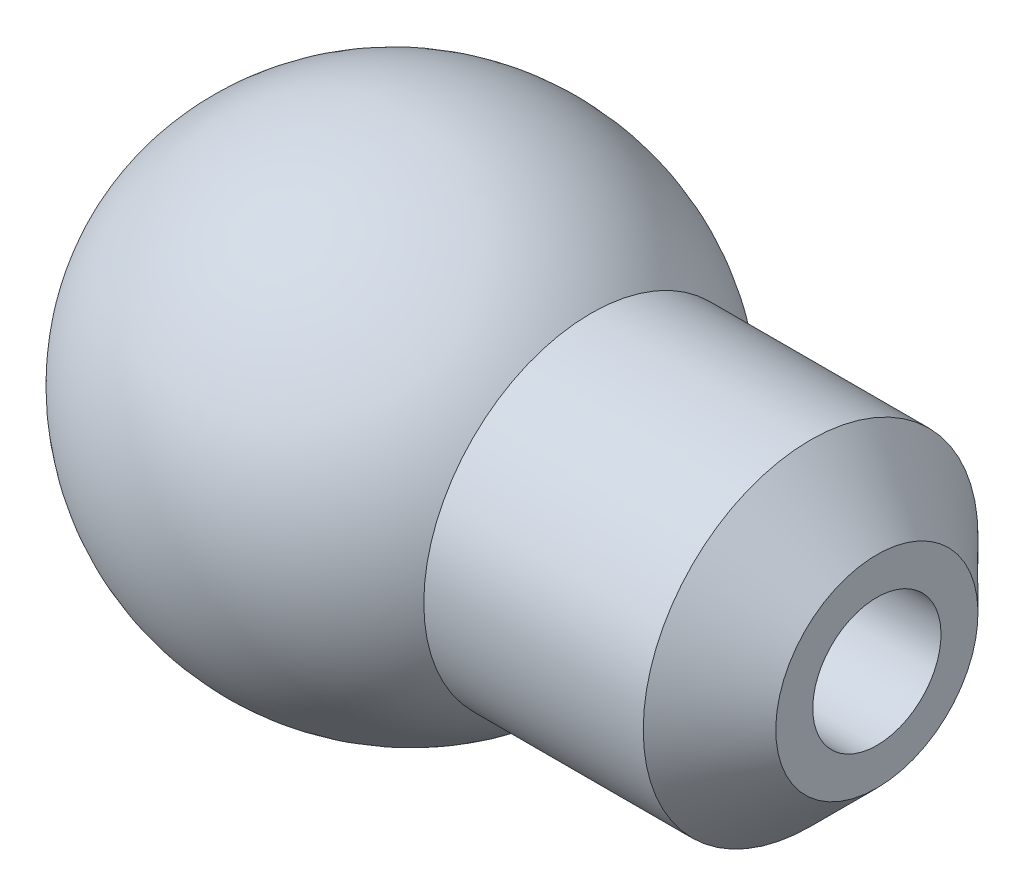
ISO-10303-21;
HEADER;
FILE_DESCRIPTION(('STEP AP214'),'2;1');
FILE_NAME('part.step','',(''),(''),'','','');
FILE_SCHEMA(('AUTOMOTIVE_DESIGN { 1 0 10303 214 1 1 1 1 }'));
ENDSEC;
DATA;
#1=APPLICATION_CONTEXT('core data for automotive mechanical design processes');
#2=APPLICATION_PROTOCOL_DEFINITION('international standard','automotive_design',2000,#1);
#3=PRODUCT_CONTEXT('',#1,'mechanical');
#4=PRODUCT('Part','Part','',(#3));
#5=PRODUCT_RELATED_PRODUCT_CATEGORY('part','',(#4));
#6=PRODUCT_DEFINITION_FORMATION('','',#4);
#7=PRODUCT_DEFINITION_CONTEXT('part definition',#1,'design');
#8=PRODUCT_DEFINITION('design','',#6,#7);
#9=PRODUCT_DEFINITION_SHAPE('','',#8);
#10=(LENGTH_UNIT() NAMED_UNIT(*) SI_UNIT(.MILLI.,.METRE.));
#11=(NAMED_UNIT(*) PLANE_ANGLE_UNIT() SI_UNIT($,.RADIAN.));
#12=(NAMED_UNIT(*) SI_UNIT($,.STERADIAN.) SOLID_ANGLE_UNIT());
#13=UNCERTAINTY_MEASURE_WITH_UNIT(LENGTH_MEASURE(1.E-05),#10,'distance_accuracy_value','');
#14=(GEOMETRIC_REPRESENTATION_CONTEXT(3) GLOBAL_UNCERTAINTY_ASSIGNED_CONTEXT((#13)) GLOBAL_UNIT_ASSIGNED_CONTEXT((#10,
#11,#12)) REPRESENTATION_CONTEXT('',''));
#15=CARTESIAN_POINT('',(0.,0.,0.));
#16=DIRECTION('',(0.,0.,1.));
#17=DIRECTION('',(1.,0.,0.));
#18=AXIS2_PLACEMENT_3D('',#15,#16,#17);
#19=CARTESIAN_POINT('',(-132.448189197613,8.05785027147283,0.));
#20=DIRECTION('',(0.,0.,-1.));
#21=DIRECTION('',(0.,-1.,0.));
#22=AXIS2_PLACEMENT_3D('',#19,#20,#21);
#23=CIRCLE('',#22,107.85323805);
#24=TRIMMED_CURVE('',#23,(PARAMETER_VALUE(-1.49601539774684)),
(PARAMETER_VALUE(1.49601539774684)),.T.,.PARAMETER.);
#25=CARTESIAN_POINT('',(-132.448189197613,0.,0.));
#26=DIRECTION('',(-1.,0.,0.));
#27=AXIS1_PLACEMENT('',#25,#26);
#28=SURFACE_OF_REVOLUTION('',#24,#27);
#29=CARTESIAN_POINT('',(-240.,0.,0.));
#30=VERTEX_POINT('',#29);
#31=VERTEX_LOOP('',#30);
#32=FACE_BOUND('',#31,.T.);
#33=CARTESIAN_POINT('',(-55.8500576850889,0.,0.));
#34=DIRECTION('',(-1.,0.,0.));
#35=DIRECTION('',(0.,-1.,0.));
#36=AXIS2_PLACEMENT_3D('',#33,#34,#35);
#37=CIRCLE('',#36,67.8700576850886);
#38=CARTESIAN_POINT('',(-55.8500576850889,-67.8700576850887,0.));
#39=VERTEX_POINT('',#38);
#40=EDGE_CURVE('E11',#39,#39,#37,.T.);
#41=ORIENTED_EDGE('',*,*,#40,.T.);
#42=EDGE_LOOP('',(#41));
#43=FACE_BOUND('',#42,.T.);
#44=ADVANCED_FACE('F37',(#32,#43),#28,.T.);
#45=CARTESIAN_POINT('',(-240.,0.,0.));
#46=DIRECTION('',(-1.,0.,0.));
#47=DIRECTION('',(0.,-1.,0.));
#48=AXIS2_PLACEMENT_3D('',#45,#46,#47);
#49=CYLINDRICAL_SURFACE('',#48,67.8700576850886);
#50=ORIENTED_EDGE('',*,*,#40,.F.);
#51=EDGE_LOOP('',(#50));
#52=FACE_BOUND('',#51,.T.);
#53=CARTESIAN_POINT('',(33.1299423149111,0.,0.));
#54=DIRECTION('',(-1.,0.,0.));
#55=DIRECTION('',(0.,-1.,0.));
#56=AXIS2_PLACEMENT_3D('',#53,#54,#55);
#57=CIRCLE('',#56,67.8700576850887);
#58=CARTESIAN_POINT('',(33.1299423149111,-67.8700576850887,0.));
#59=VERTEX_POINT('',#58);
#60=EDGE_CURVE('E43',#59,#59,#57,.T.);
#61=ORIENTED_EDGE('',*,*,#60,.T.);
#62=EDGE_LOOP('',(#61));
#63=FACE_BOUND('',#62,.T.);
#64=ADVANCED_FACE('F48',(#52,#63),#49,.T.);
#65=CARTESIAN_POINT('',(60.,0.,0.));
#66=DIRECTION('',(-1.,0.,0.));
#67=DIRECTION('',(0.,-1.,0.));
#68=AXIS2_PLACEMENT_3D('',#65,#66,#67);
#69=CONICAL_SURFACE('',#68,41.,0.785398163397443);
#70=ORIENTED_EDGE('',*,*,#60,.F.);
#71=EDGE_LOOP('',(#70));
#72=FACE_BOUND('',#71,.T.);
#73=CARTESIAN_POINT('',(60.,0.,0.));
#74=DIRECTION('',(-1.,0.,0.));
#75=DIRECTION('',(0.,-1.,0.));
#76=AXIS2_PLACEMENT_3D('',#73,#74,#75);
#77=CIRCLE('',#76,41.);
#78=CARTESIAN_POINT('',(60.,-41.,0.));
#79=VERTEX_POINT('',#78);
#80=EDGE_CURVE('E57',#79,#79,#77,.T.);
#81=ORIENTED_EDGE('',*,*,#80,.T.);
#82=EDGE_LOOP('',(#81));
#83=FACE_BOUND('',#82,.T.);
#84=ADVANCED_FACE('F53',(#72,#83),#69,.T.);
#85=CARTESIAN_POINT('',(60.,26.,0.));
#86=DIRECTION('',(-1.,0.,0.));
#87=DIRECTION('',(0.,-1.,0.));
#88=AXIS2_PLACEMENT_3D('',#85,#86,#87);
#89=PLANE('',#88);
#90=ORIENTED_EDGE('',*,*,#80,.F.);
#91=EDGE_LOOP('',(#90));
#92=FACE_BOUND('',#91,.T.);
#93=CARTESIAN_POINT('',(60.,0.,0.));
#94=DIRECTION('',(-1.,0.,0.));
#95=DIRECTION('',(0.,-1.,0.));
#96=AXIS2_PLACEMENT_3D('',#93,#94,#95);
#97=CIRCLE('',#96,26.);
#98=CARTESIAN_POINT('',(60.,-26.,0.));
#99=VERTEX_POINT('',#98);
#100=EDGE_CURVE('E59',#99,#99,#97,.T.);
#101=ORIENTED_EDGE('',*,*,#100,.T.);
#102=EDGE_LOOP('',(#101));
#103=FACE_BOUND('',#102,.T.);
#104=ADVANCED_FACE('F76',(#92,#103),#89,.F.);
#105=CARTESIAN_POINT('',(-240.,0.,0.));
#106=DIRECTION('',(-1.,0.,0.));
#107=DIRECTION('',(0.,-1.,0.));
#108=AXIS2_PLACEMENT_3D('',#105,#106,#107);
#109=CYLINDRICAL_SURFACE('',#108,26.);
#110=ORIENTED_EDGE('',*,*,#100,.F.);
#111=EDGE_LOOP('',(#110));
#112=FACE_BOUND('',#111,.T.);
#113=CARTESIAN_POINT('',(0.,0.,0.));
#114=DIRECTION('',(-1.,0.,0.));
#115=DIRECTION('',(0.,-1.,0.));
#116=AXIS2_PLACEMENT_3D('',#113,#114,#115);
#117=CIRCLE('',#116,26.);
#118=CARTESIAN_POINT('',(0.,-26.,0.));
#119=VERTEX_POINT('',#118);
#120=EDGE_CURVE('E64',#119,#119,#117,.T.);
#121=ORIENTED_EDGE('',*,*,#120,.T.);
#122=EDGE_LOOP('',(#121));
#123=FACE_BOUND('',#122,.T.);
#124=ADVANCED_FACE('F68',(#112,#123),#109,.F.);
#125=CARTESIAN_POINT('',(0.,26.,0.));
#126=DIRECTION('',(-1.,0.,0.));
#127=DIRECTION('',(0.,-1.,0.));
#128=AXIS2_PLACEMENT_3D('',#125,#126,#127);
#129=PLANE('',#128);
#130=ORIENTED_EDGE('',*,*,#120,.F.);
#131=EDGE_LOOP('',(#130));
#132=FACE_BOUND('',#131,.T.);
#133=ADVANCED_FACE('F70',(#132),#129,.F.);
#134=CLOSED_SHELL('',(#44,#64,#84,#104,#124,#133));
#135=MANIFOLD_SOLID_BREP('B2',#134);
#136=ADVANCED_BREP_SHAPE_REPRESENTATION('',(#18,#135),#14);
#137=SHAPE_DEFINITION_REPRESENTATION(#9,#136);
ENDSEC;
END-ISO-10303-21;
